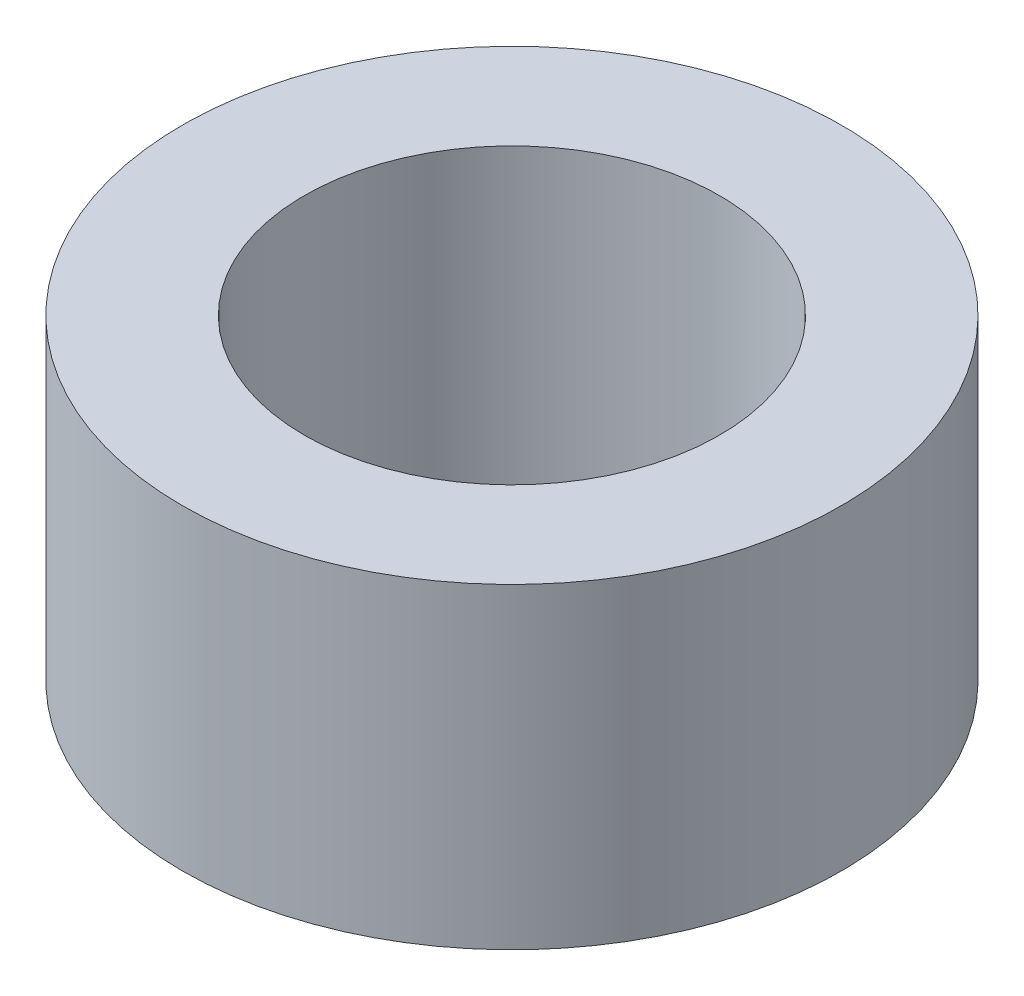
ISO-10303-21;
HEADER;
FILE_DESCRIPTION(('STEP AP214'),'2;1');
FILE_NAME('part.step','',(''),(''),'','','');
FILE_SCHEMA(('AUTOMOTIVE_DESIGN { 1 0 10303 214 1 1 1 1 }'));
ENDSEC;
DATA;
#1=APPLICATION_CONTEXT('core data for automotive mechanical design processes');
#2=APPLICATION_PROTOCOL_DEFINITION('international standard','automotive_design',2000,#1);
#3=PRODUCT_CONTEXT('',#1,'mechanical');
#4=PRODUCT('Part','Part','',(#3));
#5=PRODUCT_RELATED_PRODUCT_CATEGORY('part','',(#4));
#6=PRODUCT_DEFINITION_FORMATION('','',#4);
#7=PRODUCT_DEFINITION_CONTEXT('part definition',#1,'design');
#8=PRODUCT_DEFINITION('design','',#6,#7);
#9=PRODUCT_DEFINITION_SHAPE('','',#8);
#10=(LENGTH_UNIT() NAMED_UNIT(*) SI_UNIT(.MILLI.,.METRE.));
#11=(NAMED_UNIT(*) PLANE_ANGLE_UNIT() SI_UNIT($,.RADIAN.));
#12=(NAMED_UNIT(*) SI_UNIT($,.STERADIAN.) SOLID_ANGLE_UNIT());
#13=UNCERTAINTY_MEASURE_WITH_UNIT(LENGTH_MEASURE(1.E-05),#10,'distance_accuracy_value','');
#14=(GEOMETRIC_REPRESENTATION_CONTEXT(3) GLOBAL_UNCERTAINTY_ASSIGNED_CONTEXT((#13)) GLOBAL_UNIT_ASSIGNED_CONTEXT((#10,
#11,#12)) REPRESENTATION_CONTEXT('',''));
#15=CARTESIAN_POINT('',(0.,0.,0.));
#16=DIRECTION('',(0.,0.,1.));
#17=DIRECTION('',(1.,0.,0.));
#18=AXIS2_PLACEMENT_3D('',#15,#16,#17);
#19=CARTESIAN_POINT('',(0.,-3.048,0.));
#20=DIRECTION('',(0.,1.,0.));
#21=DIRECTION('',(0.,0.,1.));
#22=AXIS2_PLACEMENT_3D('',#19,#20,#21);
#23=CYLINDRICAL_SURFACE('',#22,3.175);
#24=CARTESIAN_POINT('',(0.,-3.048,0.));
#25=DIRECTION('',(0.,1.,0.));
#26=DIRECTION('',(0.,0.,1.));
#27=AXIS2_PLACEMENT_3D('',#24,#25,#26);
#28=CIRCLE('',#27,3.175);
#29=CARTESIAN_POINT('',(0.,-3.048,3.175));
#30=VERTEX_POINT('',#29);
#31=EDGE_CURVE('E10',#30,#30,#28,.T.);
#32=CARTESIAN_POINT('',(0.,0.,0.));
#33=DIRECTION('',(0.,1.,0.));
#34=DIRECTION('',(0.,0.,1.));
#35=AXIS2_PLACEMENT_3D('',#32,#33,#34);
#36=CIRCLE('',#35,3.175);
#37=CARTESIAN_POINT('',(0.,0.,3.175));
#38=VERTEX_POINT('',#37);
#39=EDGE_CURVE('E37',#38,#38,#36,.T.);
#40=CARTESIAN_POINT('',(0.,-3.048,3.175));
#41=CARTESIAN_POINT('',(0.,-3.01625,3.175));
#42=CARTESIAN_POINT('',(0.,-2.9845,3.175));
#43=CARTESIAN_POINT('',(0.,-2.921,3.175));
#44=CARTESIAN_POINT('',(0.,-2.88925,3.175));
#45=CARTESIAN_POINT('',(0.,-2.82575,3.175));
#46=CARTESIAN_POINT('',(0.,-2.794,3.175));
#47=CARTESIAN_POINT('',(0.,-2.7305,3.175));
#48=CARTESIAN_POINT('',(0.,-2.69875,3.175));
#49=CARTESIAN_POINT('',(0.,-2.63525,3.175));
#50=CARTESIAN_POINT('',(0.,-2.6035,3.175));
#51=CARTESIAN_POINT('',(0.,-2.54,3.175));
#52=CARTESIAN_POINT('',(0.,-2.50825,3.175));
#53=CARTESIAN_POINT('',(0.,-2.44475,3.175));
#54=CARTESIAN_POINT('',(0.,-2.413,3.175));
#55=CARTESIAN_POINT('',(0.,-2.3495,3.175));
#56=CARTESIAN_POINT('',(0.,-2.31775,3.175));
#57=CARTESIAN_POINT('',(0.,-2.25425,3.175));
#58=CARTESIAN_POINT('',(0.,-2.2225,3.175));
#59=CARTESIAN_POINT('',(0.,-2.159,3.175));
#60=CARTESIAN_POINT('',(0.,-2.12725,3.175));
#61=CARTESIAN_POINT('',(0.,-2.06375,3.175));
#62=CARTESIAN_POINT('',(0.,-2.032,3.175));
#63=CARTESIAN_POINT('',(0.,-1.9685,3.175));
#64=CARTESIAN_POINT('',(0.,-1.93675,3.175));
#65=CARTESIAN_POINT('',(0.,-1.87325,3.175));
#66=CARTESIAN_POINT('',(0.,-1.8415,3.175));
#67=CARTESIAN_POINT('',(0.,-1.778,3.175));
#68=CARTESIAN_POINT('',(0.,-1.74625,3.175));
#69=CARTESIAN_POINT('',(0.,-1.68275,3.175));
#70=CARTESIAN_POINT('',(0.,-1.651,3.175));
#71=CARTESIAN_POINT('',(0.,-1.5875,3.175));
#72=CARTESIAN_POINT('',(0.,-1.55575,3.175));
#73=CARTESIAN_POINT('',(0.,-1.49225,3.175));
#74=CARTESIAN_POINT('',(0.,-1.4605,3.175));
#75=CARTESIAN_POINT('',(0.,-1.397,3.175));
#76=CARTESIAN_POINT('',(0.,-1.36525,3.175));
#77=CARTESIAN_POINT('',(0.,-1.30175,3.175));
#78=CARTESIAN_POINT('',(0.,-1.27,3.175));
#79=CARTESIAN_POINT('',(0.,-1.2065,3.175));
#80=CARTESIAN_POINT('',(0.,-1.17475,3.175));
#81=CARTESIAN_POINT('',(0.,-1.11125,3.175));
#82=CARTESIAN_POINT('',(0.,-1.0795,3.175));
#83=CARTESIAN_POINT('',(0.,-1.016,3.175));
#84=CARTESIAN_POINT('',(0.,-0.98425,3.175));
#85=CARTESIAN_POINT('',(0.,-0.92075,3.175));
#86=CARTESIAN_POINT('',(0.,-0.889,3.175));
#87=CARTESIAN_POINT('',(0.,-0.8255,3.175));
#88=CARTESIAN_POINT('',(0.,-0.79375,3.175));
#89=CARTESIAN_POINT('',(0.,-0.73025,3.175));
#90=CARTESIAN_POINT('',(0.,-0.6985,3.175));
#91=CARTESIAN_POINT('',(0.,-0.635,3.175));
#92=CARTESIAN_POINT('',(0.,-0.60325,3.175));
#93=CARTESIAN_POINT('',(0.,-0.53975,3.175));
#94=CARTESIAN_POINT('',(0.,-0.508,3.175));
#95=CARTESIAN_POINT('',(0.,-0.4445,3.175));
#96=CARTESIAN_POINT('',(0.,-0.41275,3.175));
#97=CARTESIAN_POINT('',(0.,-0.34925,3.175));
#98=CARTESIAN_POINT('',(0.,-0.3175,3.175));
#99=CARTESIAN_POINT('',(0.,-0.254,3.175));
#100=CARTESIAN_POINT('',(0.,-0.22225,3.175));
#101=CARTESIAN_POINT('',(0.,-0.15875,3.175));
#102=CARTESIAN_POINT('',(0.,-0.127,3.175));
#103=CARTESIAN_POINT('',(0.,-0.0634999999999999,3.175));
#104=CARTESIAN_POINT('',(0.,-0.03175,3.175));
#105=CARTESIAN_POINT('',(0.,0.,3.175));
#106=B_SPLINE_CURVE_WITH_KNOTS('',3,(#40,#41,#42,#43,#44,#45,#46,#47,#48,#49,#50,#51,#52,#53,
#54,#55,#56,#57,#58,#59,#60,#61,#62,#63,#64,#65,#66,#67,#68,#69,#70,#71,#72,#73,#74,#75,#76,#77,
#78,#79,#80,#81,#82,#83,#84,#85,#86,#87,#88,#89,#90,#91,#92,#93,#94,#95,#96,#97,#98,#99,#100,
#101,#102,#103,#104,#105),.UNSPECIFIED.,.F.,.F.,(4,2,2,2,2,2,2,2,2,2,2,2,2,2,2,2,2,2,2,2,2,2,2,
2,2,2,2,2,2,2,2,2,4),(0.,0.0952499999999998,0.1905,0.28575,0.381,0.47625,0.5715,0.66675,0.762,
0.85725,0.9525,1.04775,1.143,1.23825,1.3335,1.42875,1.524,1.61925,1.7145,1.80975,1.905,2.00025,
2.0955,2.19075,2.286,2.38125,2.4765,2.57175,2.667,2.76225,2.8575,2.95275,3.048),.UNSPECIFIED.);
#107=EDGE_CURVE('BSEAM34',#30,#38,#106,.T.);
#108=ORIENTED_EDGE('',*,*,#31,.T.);
#109=ORIENTED_EDGE('',*,*,#39,.F.);
#110=ORIENTED_EDGE('',*,*,#107,.T.);
#111=ORIENTED_EDGE('',*,*,#107,.F.);
#112=EDGE_LOOP('',(#108,#110,#109,#111));
#113=FACE_BOUND('',#112,.T.);
#114=ADVANCED_FACE('F34',(#113),#23,.T.);
#115=CARTESIAN_POINT('',(0.,-3.048,0.));
#116=DIRECTION('',(0.,1.,0.));
#117=DIRECTION('',(0.,0.,1.));
#118=AXIS2_PLACEMENT_3D('',#115,#116,#117);
#119=PLANE('',#118);
#120=CARTESIAN_POINT('',(0.,-3.048,0.));
#121=DIRECTION('',(0.,1.,0.));
#122=DIRECTION('',(0.,0.,1.));
#123=AXIS2_PLACEMENT_3D('',#120,#121,#122);
#124=CIRCLE('',#123,1.999996);
#125=CARTESIAN_POINT('',(0.,-3.048,1.999996));
#126=VERTEX_POINT('',#125);
#127=EDGE_CURVE('E44',#126,#126,#124,.T.);
#128=ORIENTED_EDGE('',*,*,#127,.T.);
#129=EDGE_LOOP('',(#128));
#130=FACE_BOUND('',#129,.T.);
#131=ORIENTED_EDGE('',*,*,#31,.F.);
#132=EDGE_LOOP('',(#131));
#133=FACE_BOUND('',#132,.T.);
#134=ADVANCED_FACE('F52',(#130,#133),#119,.F.);
#135=CARTESIAN_POINT('',(0.,0.,0.));
#136=DIRECTION('',(0.,1.,0.));
#137=DIRECTION('',(0.,0.,1.));
#138=AXIS2_PLACEMENT_3D('',#135,#136,#137);
#139=PLANE('',#138);
#140=CARTESIAN_POINT('',(0.,0.,0.));
#141=DIRECTION('',(0.,1.,0.));
#142=DIRECTION('',(0.,0.,1.));
#143=AXIS2_PLACEMENT_3D('',#140,#141,#142);
#144=CIRCLE('',#143,1.999996);
#145=CARTESIAN_POINT('',(0.,0.,1.999996));
#146=VERTEX_POINT('',#145);
#147=EDGE_CURVE('E46',#146,#146,#144,.T.);
#148=ORIENTED_EDGE('',*,*,#147,.F.);
#149=EDGE_LOOP('',(#148));
#150=FACE_BOUND('',#149,.T.);
#151=ORIENTED_EDGE('',*,*,#39,.T.);
#152=EDGE_LOOP('',(#151));
#153=FACE_BOUND('',#152,.T.);
#154=ADVANCED_FACE('F58',(#150,#153),#139,.T.);
#155=CARTESIAN_POINT('',(0.,-3.048,0.));
#156=DIRECTION('',(0.,1.,0.));
#157=DIRECTION('',(0.,0.,1.));
#158=AXIS2_PLACEMENT_3D('',#155,#156,#157);
#159=CYLINDRICAL_SURFACE('',#158,1.999996);
#160=CARTESIAN_POINT('',(0.,-3.048,1.999996));
#161=CARTESIAN_POINT('',(0.,-3.01625,1.999996));
#162=CARTESIAN_POINT('',(0.,-2.9845,1.999996));
#163=CARTESIAN_POINT('',(0.,-2.921,1.999996));
#164=CARTESIAN_POINT('',(0.,-2.88925,1.999996));
#165=CARTESIAN_POINT('',(0.,-2.82575,1.999996));
#166=CARTESIAN_POINT('',(0.,-2.794,1.999996));
#167=CARTESIAN_POINT('',(0.,-2.7305,1.999996));
#168=CARTESIAN_POINT('',(0.,-2.69875,1.999996));
#169=CARTESIAN_POINT('',(0.,-2.63525,1.999996));
#170=CARTESIAN_POINT('',(0.,-2.6035,1.999996));
#171=CARTESIAN_POINT('',(0.,-2.54,1.999996));
#172=CARTESIAN_POINT('',(0.,-2.50825,1.999996));
#173=CARTESIAN_POINT('',(0.,-2.44475,1.999996));
#174=CARTESIAN_POINT('',(0.,-2.413,1.999996));
#175=CARTESIAN_POINT('',(0.,-2.3495,1.999996));
#176=CARTESIAN_POINT('',(0.,-2.31775,1.999996));
#177=CARTESIAN_POINT('',(0.,-2.25425,1.999996));
#178=CARTESIAN_POINT('',(0.,-2.2225,1.999996));
#179=CARTESIAN_POINT('',(0.,-2.159,1.999996));
#180=CARTESIAN_POINT('',(0.,-2.12725,1.999996));
#181=CARTESIAN_POINT('',(0.,-2.06375,1.999996));
#182=CARTESIAN_POINT('',(0.,-2.032,1.999996));
#183=CARTESIAN_POINT('',(0.,-1.9685,1.999996));
#184=CARTESIAN_POINT('',(0.,-1.93675,1.999996));
#185=CARTESIAN_POINT('',(0.,-1.87325,1.999996));
#186=CARTESIAN_POINT('',(0.,-1.8415,1.999996));
#187=CARTESIAN_POINT('',(0.,-1.778,1.999996));
#188=CARTESIAN_POINT('',(0.,-1.74625,1.999996));
#189=CARTESIAN_POINT('',(0.,-1.68275,1.999996));
#190=CARTESIAN_POINT('',(0.,-1.651,1.999996));
#191=CARTESIAN_POINT('',(0.,-1.5875,1.999996));
#192=CARTESIAN_POINT('',(0.,-1.55575,1.999996));
#193=CARTESIAN_POINT('',(0.,-1.49225,1.999996));
#194=CARTESIAN_POINT('',(0.,-1.4605,1.999996));
#195=CARTESIAN_POINT('',(0.,-1.397,1.999996));
#196=CARTESIAN_POINT('',(0.,-1.36525,1.999996));
#197=CARTESIAN_POINT('',(0.,-1.30175,1.999996));
#198=CARTESIAN_POINT('',(0.,-1.27,1.999996));
#199=CARTESIAN_POINT('',(0.,-1.2065,1.999996));
#200=CARTESIAN_POINT('',(0.,-1.17475,1.999996));
#201=CARTESIAN_POINT('',(0.,-1.11125,1.999996));
#202=CARTESIAN_POINT('',(0.,-1.0795,1.999996));
#203=CARTESIAN_POINT('',(0.,-1.016,1.999996));
#204=CARTESIAN_POINT('',(0.,-0.98425,1.999996));
#205=CARTESIAN_POINT('',(0.,-0.92075,1.999996));
#206=CARTESIAN_POINT('',(0.,-0.889,1.999996));
#207=CARTESIAN_POINT('',(0.,-0.8255,1.999996));
#208=CARTESIAN_POINT('',(0.,-0.79375,1.999996));
#209=CARTESIAN_POINT('',(0.,-0.73025,1.999996));
#210=CARTESIAN_POINT('',(0.,-0.6985,1.999996));
#211=CARTESIAN_POINT('',(0.,-0.635,1.999996));
#212=CARTESIAN_POINT('',(0.,-0.60325,1.999996));
#213=CARTESIAN_POINT('',(0.,-0.53975,1.999996));
#214=CARTESIAN_POINT('',(0.,-0.508,1.999996));
#215=CARTESIAN_POINT('',(0.,-0.4445,1.999996));
#216=CARTESIAN_POINT('',(0.,-0.41275,1.999996));
#217=CARTESIAN_POINT('',(0.,-0.34925,1.999996));
#218=CARTESIAN_POINT('',(0.,-0.3175,1.999996));
#219=CARTESIAN_POINT('',(0.,-0.254,1.999996));
#220=CARTESIAN_POINT('',(0.,-0.22225,1.999996));
#221=CARTESIAN_POINT('',(0.,-0.15875,1.999996));
#222=CARTESIAN_POINT('',(0.,-0.127,1.999996));
#223=CARTESIAN_POINT('',(0.,-0.0634999999999999,1.999996));
#224=CARTESIAN_POINT('',(0.,-0.03175,1.999996));
#225=CARTESIAN_POINT('',(0.,0.,1.999996));
#226=B_SPLINE_CURVE_WITH_KNOTS('',3,(#160,#161,#162,#163,#164,#165,#166,#167,#168,#169,#170,
#171,#172,#173,#174,#175,#176,#177,#178,#179,#180,#181,#182,#183,#184,#185,#186,#187,#188,#189,
#190,#191,#192,#193,#194,#195,#196,#197,#198,#199,#200,#201,#202,#203,#204,#205,#206,#207,#208,
#209,#210,#211,#212,#213,#214,#215,#216,#217,#218,#219,#220,#221,#222,#223,#224,#225),
.UNSPECIFIED.,.F.,.F.,(4,2,2,2,2,2,2,2,2,2,2,2,2,2,2,2,2,2,2,2,2,2,2,2,2,2,2,2,2,2,2,2,4),(0.,
0.0952500000000003,0.1905,0.28575,0.381,0.47625,0.5715,0.66675,0.762000000000001,0.85725,0.9525,
1.04775,1.143,1.23825,1.3335,1.42875,1.524,1.61925,1.7145,1.80975,1.905,2.00025,2.0955,2.19075,
2.286,2.38125,2.4765,2.57175,2.667,2.76225,2.8575,2.95275,3.048),.UNSPECIFIED.);
#227=EDGE_CURVE('BSEAM55',#126,#146,#226,.T.);
#228=ORIENTED_EDGE('',*,*,#127,.F.);
#229=ORIENTED_EDGE('',*,*,#147,.T.);
#230=ORIENTED_EDGE('',*,*,#227,.T.);
#231=ORIENTED_EDGE('',*,*,#227,.F.);
#232=EDGE_LOOP('',(#228,#230,#229,#231));
#233=FACE_BOUND('',#232,.T.);
#234=ADVANCED_FACE('F55',(#233),#159,.F.);
#235=CLOSED_SHELL('',(#114,#134,#154,#234));
#236=MANIFOLD_SOLID_BREP('B2',#235);
#237=ADVANCED_BREP_SHAPE_REPRESENTATION('',(#18,#236),#14);
#238=SHAPE_DEFINITION_REPRESENTATION(#9,#237);
ENDSEC;
END-ISO-10303-21;
